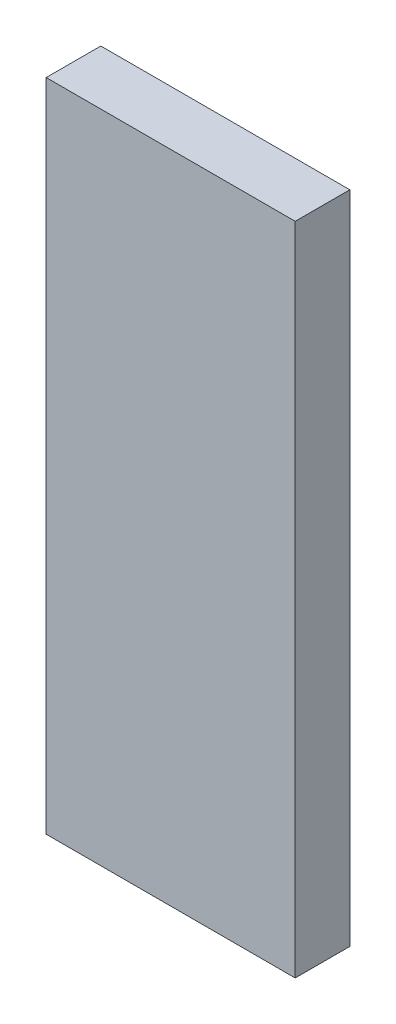
ISO-10303-21;
HEADER;
FILE_DESCRIPTION(('STEP AP214'),'2;1');
FILE_NAME('part.step','',(''),(''),'','','');
FILE_SCHEMA(('AUTOMOTIVE_DESIGN { 1 0 10303 214 1 1 1 1 }'));
ENDSEC;
DATA;
#1=APPLICATION_CONTEXT('core data for automotive mechanical design processes');
#2=APPLICATION_PROTOCOL_DEFINITION('international standard','automotive_design',2000,#1);
#3=PRODUCT_CONTEXT('',#1,'mechanical');
#4=PRODUCT('Part','Part','',(#3));
#5=PRODUCT_RELATED_PRODUCT_CATEGORY('part','',(#4));
#6=PRODUCT_DEFINITION_FORMATION('','',#4);
#7=PRODUCT_DEFINITION_CONTEXT('part definition',#1,'design');
#8=PRODUCT_DEFINITION('design','',#6,#7);
#9=PRODUCT_DEFINITION_SHAPE('','',#8);
#10=(LENGTH_UNIT() NAMED_UNIT(*) SI_UNIT(.MILLI.,.METRE.));
#11=(NAMED_UNIT(*) PLANE_ANGLE_UNIT() SI_UNIT($,.RADIAN.));
#12=(NAMED_UNIT(*) SI_UNIT($,.STERADIAN.) SOLID_ANGLE_UNIT());
#13=UNCERTAINTY_MEASURE_WITH_UNIT(LENGTH_MEASURE(1.E-05),#10,'distance_accuracy_value','');
#14=(GEOMETRIC_REPRESENTATION_CONTEXT(3) GLOBAL_UNCERTAINTY_ASSIGNED_CONTEXT((#13)) GLOBAL_UNIT_ASSIGNED_CONTEXT((#10,
#11,#12)) REPRESENTATION_CONTEXT('',''));
#15=CARTESIAN_POINT('',(0.,0.,0.));
#16=DIRECTION('',(0.,0.,1.));
#17=DIRECTION('',(1.,0.,0.));
#18=AXIS2_PLACEMENT_3D('',#15,#16,#17);
#19=CARTESIAN_POINT('',(0.,0.,3.175));
#20=DIRECTION('',(1.,0.,0.));
#21=DIRECTION('',(0.,0.,-1.));
#22=AXIS2_PLACEMENT_3D('',#19,#20,#21);
#23=PLANE('',#22);
#24=DIRECTION('',(0.,-1.,0.));
#25=VECTOR('',#24,1.);
#26=CARTESIAN_POINT('',(0.,0.,0.));
#27=LINE('',#26,#25);
#28=CARTESIAN_POINT('',(0.,38.1,0.));
#29=VERTEX_POINT('',#28);
#30=CARTESIAN_POINT('',(0.,0.,0.));
#31=VERTEX_POINT('',#30);
#32=EDGE_CURVE('E101',#29,#31,#27,.T.);
#33=ORIENTED_EDGE('',*,*,#32,.T.);
#34=DIRECTION('',(0.,0.,-1.));
#35=VECTOR('',#34,1.);
#36=CARTESIAN_POINT('',(0.,0.,3.175));
#37=LINE('',#36,#35);
#38=CARTESIAN_POINT('',(0.,0.,3.175));
#39=VERTEX_POINT('',#38);
#40=EDGE_CURVE('E11',#39,#31,#37,.T.);
#41=ORIENTED_EDGE('',*,*,#40,.F.);
#42=DIRECTION('',(0.,-1.,0.));
#43=VECTOR('',#42,1.);
#44=CARTESIAN_POINT('',(0.,0.,3.175));
#45=LINE('',#44,#43);
#46=CARTESIAN_POINT('',(0.,38.1,3.175));
#47=VERTEX_POINT('',#46);
#48=EDGE_CURVE('E89',#47,#39,#45,.T.);
#49=ORIENTED_EDGE('',*,*,#48,.F.);
#50=DIRECTION('',(0.,0.,-1.));
#51=VECTOR('',#50,1.);
#52=CARTESIAN_POINT('',(0.,38.1,3.175));
#53=LINE('',#52,#51);
#54=EDGE_CURVE('E97',#47,#29,#53,.T.);
#55=ORIENTED_EDGE('',*,*,#54,.T.);
#56=EDGE_LOOP('',(#33,#41,#49,#55));
#57=FACE_BOUND('',#56,.T.);
#58=ADVANCED_FACE('F38',(#57),#23,.F.);
#59=CARTESIAN_POINT('',(0.,0.,3.175));
#60=DIRECTION('',(0.,1.,0.));
#61=DIRECTION('',(0.,0.,1.));
#62=AXIS2_PLACEMENT_3D('',#59,#60,#61);
#63=PLANE('',#62);
#64=DIRECTION('',(1.,0.,0.));
#65=VECTOR('',#64,1.);
#66=CARTESIAN_POINT('',(0.,0.,0.));
#67=LINE('',#66,#65);
#68=CARTESIAN_POINT('',(14.478,0.,0.));
#69=VERTEX_POINT('',#68);
#70=EDGE_CURVE('E93',#31,#69,#67,.T.);
#71=ORIENTED_EDGE('',*,*,#70,.T.);
#72=DIRECTION('',(0.,0.,-1.));
#73=VECTOR('',#72,1.);
#74=CARTESIAN_POINT('',(14.478,0.,3.175));
#75=LINE('',#74,#73);
#76=CARTESIAN_POINT('',(14.478,0.,3.175));
#77=VERTEX_POINT('',#76);
#78=EDGE_CURVE('E46',#77,#69,#75,.T.);
#79=ORIENTED_EDGE('',*,*,#78,.F.);
#80=DIRECTION('',(1.,0.,0.));
#81=VECTOR('',#80,1.);
#82=CARTESIAN_POINT('',(0.,0.,3.175));
#83=LINE('',#82,#81);
#84=EDGE_CURVE('E84',#39,#77,#83,.T.);
#85=ORIENTED_EDGE('',*,*,#84,.F.);
#86=ORIENTED_EDGE('',*,*,#40,.T.);
#87=EDGE_LOOP('',(#71,#79,#85,#86));
#88=FACE_BOUND('',#87,.T.);
#89=ADVANCED_FACE('F92',(#88),#63,.F.);
#90=CARTESIAN_POINT('',(14.478,0.,3.175));
#91=DIRECTION('',(-1.,0.,0.));
#92=DIRECTION('',(0.,-1.,0.));
#93=AXIS2_PLACEMENT_3D('',#90,#91,#92);
#94=PLANE('',#93);
#95=DIRECTION('',(0.,1.,0.));
#96=VECTOR('',#95,1.);
#97=CARTESIAN_POINT('',(14.478,0.,0.));
#98=LINE('',#97,#96);
#99=CARTESIAN_POINT('',(14.478,38.1,0.));
#100=VERTEX_POINT('',#99);
#101=EDGE_CURVE('E71',#69,#100,#98,.T.);
#102=ORIENTED_EDGE('',*,*,#101,.T.);
#103=DIRECTION('',(0.,0.,-1.));
#104=VECTOR('',#103,1.);
#105=CARTESIAN_POINT('',(14.478,38.1,3.175));
#106=LINE('',#105,#104);
#107=CARTESIAN_POINT('',(14.478,38.1,3.175));
#108=VERTEX_POINT('',#107);
#109=EDGE_CURVE('E94',#108,#100,#106,.T.);
#110=ORIENTED_EDGE('',*,*,#109,.F.);
#111=DIRECTION('',(0.,1.,0.));
#112=VECTOR('',#111,1.);
#113=CARTESIAN_POINT('',(14.478,0.,3.175));
#114=LINE('',#113,#112);
#115=EDGE_CURVE('E87',#77,#108,#114,.T.);
#116=ORIENTED_EDGE('',*,*,#115,.F.);
#117=ORIENTED_EDGE('',*,*,#78,.T.);
#118=EDGE_LOOP('',(#102,#110,#116,#117));
#119=FACE_BOUND('',#118,.T.);
#120=ADVANCED_FACE('F95',(#119),#94,.F.);
#121=CARTESIAN_POINT('',(0.,38.1,3.175));
#122=DIRECTION('',(0.,-1.,0.));
#123=DIRECTION('',(0.,0.,-1.));
#124=AXIS2_PLACEMENT_3D('',#121,#122,#123);
#125=PLANE('',#124);
#126=DIRECTION('',(-1.,0.,0.));
#127=VECTOR('',#126,1.);
#128=CARTESIAN_POINT('',(0.,38.1,0.));
#129=LINE('',#128,#127);
#130=EDGE_CURVE('E77',#100,#29,#129,.T.);
#131=ORIENTED_EDGE('',*,*,#130,.T.);
#132=ORIENTED_EDGE('',*,*,#54,.F.);
#133=DIRECTION('',(-1.,0.,0.));
#134=VECTOR('',#133,1.);
#135=CARTESIAN_POINT('',(0.,38.1,3.175));
#136=LINE('',#135,#134);
#137=EDGE_CURVE('E54',#108,#47,#136,.T.);
#138=ORIENTED_EDGE('',*,*,#137,.F.);
#139=ORIENTED_EDGE('',*,*,#109,.T.);
#140=EDGE_LOOP('',(#131,#132,#138,#139));
#141=FACE_BOUND('',#140,.T.);
#142=ADVANCED_FACE('F108',(#141),#125,.F.);
#143=CARTESIAN_POINT('',(0.,0.,3.175));
#144=DIRECTION('',(0.,0.,-1.));
#145=DIRECTION('',(-1.,0.,0.));
#146=AXIS2_PLACEMENT_3D('',#143,#144,#145);
#147=PLANE('',#146);
#148=ORIENTED_EDGE('',*,*,#48,.T.);
#149=ORIENTED_EDGE('',*,*,#84,.T.);
#150=ORIENTED_EDGE('',*,*,#115,.T.);
#151=ORIENTED_EDGE('',*,*,#137,.T.);
#152=EDGE_LOOP('',(#148,#149,#150,#151));
#153=FACE_BOUND('',#152,.T.);
#154=ADVANCED_FACE('F85',(#153),#147,.F.);
#155=CARTESIAN_POINT('',(0.,0.,0.));
#156=DIRECTION('',(0.,0.,-1.));
#157=DIRECTION('',(-1.,0.,0.));
#158=AXIS2_PLACEMENT_3D('',#155,#156,#157);
#159=PLANE('',#158);
#160=ORIENTED_EDGE('',*,*,#32,.F.);
#161=ORIENTED_EDGE('',*,*,#130,.F.);
#162=ORIENTED_EDGE('',*,*,#101,.F.);
#163=ORIENTED_EDGE('',*,*,#70,.F.);
#164=EDGE_LOOP('',(#160,#161,#162,#163));
#165=FACE_BOUND('',#164,.T.);
#166=ADVANCED_FACE('F111',(#165),#159,.T.);
#167=CLOSED_SHELL('',(#58,#89,#120,#142,#154,#166));
#168=MANIFOLD_SOLID_BREP('B2',#167);
#169=ADVANCED_BREP_SHAPE_REPRESENTATION('',(#18,#168),#14);
#170=SHAPE_DEFINITION_REPRESENTATION(#9,#169);
ENDSEC;
END-ISO-10303-21;
